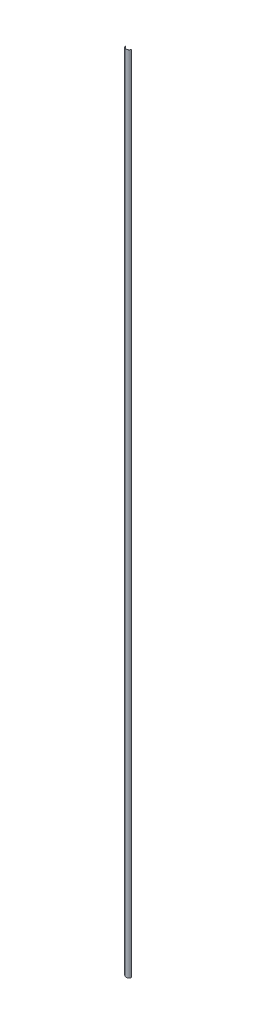
ISO-10303-21;
HEADER;
FILE_DESCRIPTION(('STEP AP214'),'2;1');
FILE_NAME('part.step','',(''),(''),'','','');
FILE_SCHEMA(('AUTOMOTIVE_DESIGN { 1 0 10303 214 1 1 1 1 }'));
ENDSEC;
DATA;
#1=APPLICATION_CONTEXT('core data for automotive mechanical design processes');
#2=APPLICATION_PROTOCOL_DEFINITION('international standard','automotive_design',2000,#1);
#3=PRODUCT_CONTEXT('',#1,'mechanical');
#4=PRODUCT('Part','Part','',(#3));
#5=PRODUCT_RELATED_PRODUCT_CATEGORY('part','',(#4));
#6=PRODUCT_DEFINITION_FORMATION('','',#4);
#7=PRODUCT_DEFINITION_CONTEXT('part definition',#1,'design');
#8=PRODUCT_DEFINITION('design','',#6,#7);
#9=PRODUCT_DEFINITION_SHAPE('','',#8);
#10=(LENGTH_UNIT() NAMED_UNIT(*) SI_UNIT(.MILLI.,.METRE.));
#11=(NAMED_UNIT(*) PLANE_ANGLE_UNIT() SI_UNIT($,.RADIAN.));
#12=(NAMED_UNIT(*) SI_UNIT($,.STERADIAN.) SOLID_ANGLE_UNIT());
#13=UNCERTAINTY_MEASURE_WITH_UNIT(LENGTH_MEASURE(1.E-05),#10,'distance_accuracy_value','');
#14=(GEOMETRIC_REPRESENTATION_CONTEXT(3) GLOBAL_UNCERTAINTY_ASSIGNED_CONTEXT((#13)) GLOBAL_UNIT_ASSIGNED_CONTEXT((#10,
#11,#12)) REPRESENTATION_CONTEXT('',''));
#15=CARTESIAN_POINT('',(0.,0.,0.));
#16=DIRECTION('',(0.,0.,1.));
#17=DIRECTION('',(1.,0.,0.));
#18=AXIS2_PLACEMENT_3D('',#15,#16,#17);
#19=CARTESIAN_POINT('',(0.,-2005.,0.));
#20=DIRECTION('',(0.,1.,0.));
#21=DIRECTION('',(0.,0.,1.));
#22=AXIS2_PLACEMENT_3D('',#19,#20,#21);
#23=CYLINDRICAL_SURFACE('',#22,7.77520672963266);
#24=CARTESIAN_POINT('',(0.,0.,0.));
#25=DIRECTION('',(0.,-1.,0.));
#26=DIRECTION('',(0.,0.,1.));
#27=AXIS2_PLACEMENT_3D('',#24,#25,#26);
#28=CIRCLE('',#27,7.77520672963266);
#29=CARTESIAN_POINT('',(7.48031993760472,0.,2.12100290419375));
#30=VERTEX_POINT('',#29);
#31=CARTESIAN_POINT('',(-7.51968006239528,0.,1.97692980344267));
#32=VERTEX_POINT('',#31);
#33=EDGE_CURVE('E81',#30,#32,#28,.T.);
#34=ORIENTED_EDGE('',*,*,#33,.T.);
#35=DIRECTION('',(0.,1.,0.));
#36=VECTOR('',#35,1.);
#37=CARTESIAN_POINT('',(-7.51968006239528,-2005.,1.97692980344267));
#38=LINE('',#37,#36);
#39=CARTESIAN_POINT('',(-7.51968006239528,-2005.,1.97692980344267));
#40=VERTEX_POINT('',#39);
#41=EDGE_CURVE('E11',#40,#32,#38,.T.);
#42=ORIENTED_EDGE('',*,*,#41,.F.);
#43=CARTESIAN_POINT('',(0.,-2005.,0.));
#44=DIRECTION('',(0.,-1.,0.));
#45=DIRECTION('',(0.,0.,1.));
#46=AXIS2_PLACEMENT_3D('',#43,#44,#45);
#47=CIRCLE('',#46,7.77520672963266);
#48=CARTESIAN_POINT('',(7.48031993760472,-2005.,2.12100290419375));
#49=VERTEX_POINT('',#48);
#50=EDGE_CURVE('E84',#49,#40,#47,.T.);
#51=ORIENTED_EDGE('',*,*,#50,.F.);
#52=DIRECTION('',(0.,1.,0.));
#53=VECTOR('',#52,1.);
#54=CARTESIAN_POINT('',(7.48031993760472,-2005.,2.12100290419375));
#55=LINE('',#54,#53);
#56=EDGE_CURVE('E91',#49,#30,#55,.T.);
#57=ORIENTED_EDGE('',*,*,#56,.T.);
#58=EDGE_LOOP('',(#34,#42,#51,#57));
#59=FACE_BOUND('',#58,.T.);
#60=ADVANCED_FACE('F38',(#59),#23,.T.);
#61=CARTESIAN_POINT('',(-7.51968006239528,-2005.,1.97692980344267));
#62=DIRECTION('',(0.,0.,1.));
#63=DIRECTION('',(1.,0.,0.));
#64=AXIS2_PLACEMENT_3D('',#61,#62,#63);
#65=PLANE('',#64);
#66=DIRECTION('',(1.,0.,0.));
#67=VECTOR('',#66,1.);
#68=CARTESIAN_POINT('',(-7.51968006239528,0.,1.97692980344267));
#69=LINE('',#68,#67);
#70=CARTESIAN_POINT('',(-7.41968006239528,0.,1.97692980344267));
#71=VERTEX_POINT('',#70);
#72=EDGE_CURVE('E96',#32,#71,#69,.T.);
#73=ORIENTED_EDGE('',*,*,#72,.T.);
#74=DIRECTION('',(0.,1.,0.));
#75=VECTOR('',#74,1.);
#76=CARTESIAN_POINT('',(-7.41968006239528,-2005.,1.97692980344267));
#77=LINE('',#76,#75);
#78=CARTESIAN_POINT('',(-7.41968006239528,-2005.,1.97692980344267));
#79=VERTEX_POINT('',#78);
#80=EDGE_CURVE('E46',#79,#71,#77,.T.);
#81=ORIENTED_EDGE('',*,*,#80,.F.);
#82=DIRECTION('',(1.,0.,0.));
#83=VECTOR('',#82,1.);
#84=CARTESIAN_POINT('',(-7.51968006239528,-2005.,1.97692980344267));
#85=LINE('',#84,#83);
#86=EDGE_CURVE('E105',#40,#79,#85,.T.);
#87=ORIENTED_EDGE('',*,*,#86,.F.);
#88=ORIENTED_EDGE('',*,*,#41,.T.);
#89=EDGE_LOOP('',(#73,#81,#87,#88));
#90=FACE_BOUND('',#89,.T.);
#91=ADVANCED_FACE('F110',(#90),#65,.F.);
#92=CARTESIAN_POINT('',(0.,-2005.,0.));
#93=DIRECTION('',(0.,1.,0.));
#94=DIRECTION('',(0.,0.,1.));
#95=AXIS2_PLACEMENT_3D('',#92,#93,#94);
#96=CYLINDRICAL_SURFACE('',#95,7.67853525589653);
#97=CARTESIAN_POINT('',(0.,0.,0.));
#98=DIRECTION('',(0.,1.,0.));
#99=DIRECTION('',(0.,0.,1.));
#100=AXIS2_PLACEMENT_3D('',#97,#98,#99);
#101=CIRCLE('',#100,7.67853525589653);
#102=CARTESIAN_POINT('',(7.37978660643027,0.,2.12100290419375));
#103=VERTEX_POINT('',#102);
#104=EDGE_CURVE('E78',#71,#103,#101,.T.);
#105=ORIENTED_EDGE('',*,*,#104,.T.);
#106=DIRECTION('',(0.,1.,0.));
#107=VECTOR('',#106,1.);
#108=CARTESIAN_POINT('',(7.37978660643027,-2005.,2.12100290419375));
#109=LINE('',#108,#107);
#110=CARTESIAN_POINT('',(7.37978660643027,-2005.,2.12100290419375));
#111=VERTEX_POINT('',#110);
#112=EDGE_CURVE('E87',#111,#103,#109,.T.);
#113=ORIENTED_EDGE('',*,*,#112,.F.);
#114=CARTESIAN_POINT('',(0.,-2005.,0.));
#115=DIRECTION('',(0.,1.,0.));
#116=DIRECTION('',(0.,0.,1.));
#117=AXIS2_PLACEMENT_3D('',#114,#115,#116);
#118=CIRCLE('',#117,7.67853525589653);
#119=EDGE_CURVE('E103',#79,#111,#118,.T.);
#120=ORIENTED_EDGE('',*,*,#119,.F.);
#121=ORIENTED_EDGE('',*,*,#80,.T.);
#122=EDGE_LOOP('',(#105,#113,#120,#121));
#123=FACE_BOUND('',#122,.T.);
#124=ADVANCED_FACE('F94',(#123),#96,.F.);
#125=CARTESIAN_POINT('',(7.37978660643027,-2005.,2.12100290419375));
#126=DIRECTION('',(0.,0.,1.));
#127=DIRECTION('',(1.,0.,0.));
#128=AXIS2_PLACEMENT_3D('',#125,#126,#127);
#129=PLANE('',#128);
#130=DIRECTION('',(1.,0.,0.));
#131=VECTOR('',#130,1.);
#132=CARTESIAN_POINT('',(7.37978660643027,0.,2.12100290419375));
#133=LINE('',#132,#131);
#134=EDGE_CURVE('E74',#103,#30,#133,.T.);
#135=ORIENTED_EDGE('',*,*,#134,.T.);
#136=ORIENTED_EDGE('',*,*,#56,.F.);
#137=DIRECTION('',(1.,0.,0.));
#138=VECTOR('',#137,1.);
#139=CARTESIAN_POINT('',(7.37978660643027,-2005.,2.12100290419375));
#140=LINE('',#139,#138);
#141=EDGE_CURVE('E53',#111,#49,#140,.T.);
#142=ORIENTED_EDGE('',*,*,#141,.F.);
#143=ORIENTED_EDGE('',*,*,#112,.T.);
#144=EDGE_LOOP('',(#135,#136,#142,#143));
#145=FACE_BOUND('',#144,.T.);
#146=ADVANCED_FACE('F88',(#145),#129,.F.);
#147=CARTESIAN_POINT('',(0.,-2005.,0.));
#148=DIRECTION('',(0.,1.,0.));
#149=DIRECTION('',(0.,0.,1.));
#150=AXIS2_PLACEMENT_3D('',#147,#148,#149);
#151=PLANE('',#150);
#152=ORIENTED_EDGE('',*,*,#50,.T.);
#153=ORIENTED_EDGE('',*,*,#86,.T.);
#154=ORIENTED_EDGE('',*,*,#119,.T.);
#155=ORIENTED_EDGE('',*,*,#141,.T.);
#156=EDGE_LOOP('',(#152,#153,#154,#155));
#157=FACE_BOUND('',#156,.T.);
#158=ADVANCED_FACE('F111',(#157),#151,.F.);
#159=CARTESIAN_POINT('',(0.,0.,0.));
#160=DIRECTION('',(0.,1.,0.));
#161=DIRECTION('',(0.,0.,1.));
#162=AXIS2_PLACEMENT_3D('',#159,#160,#161);
#163=PLANE('',#162);
#164=ORIENTED_EDGE('',*,*,#33,.F.);
#165=ORIENTED_EDGE('',*,*,#134,.F.);
#166=ORIENTED_EDGE('',*,*,#104,.F.);
#167=ORIENTED_EDGE('',*,*,#72,.F.);
#168=EDGE_LOOP('',(#164,#165,#166,#167));
#169=FACE_BOUND('',#168,.T.);
#170=ADVANCED_FACE('F76',(#169),#163,.T.);
#171=CLOSED_SHELL('',(#60,#91,#124,#146,#158,#170));
#172=MANIFOLD_SOLID_BREP('B2',#171);
#173=ADVANCED_BREP_SHAPE_REPRESENTATION('',(#18,#172),#14);
#174=SHAPE_DEFINITION_REPRESENTATION(#9,#173);
ENDSEC;
END-ISO-10303-21;
